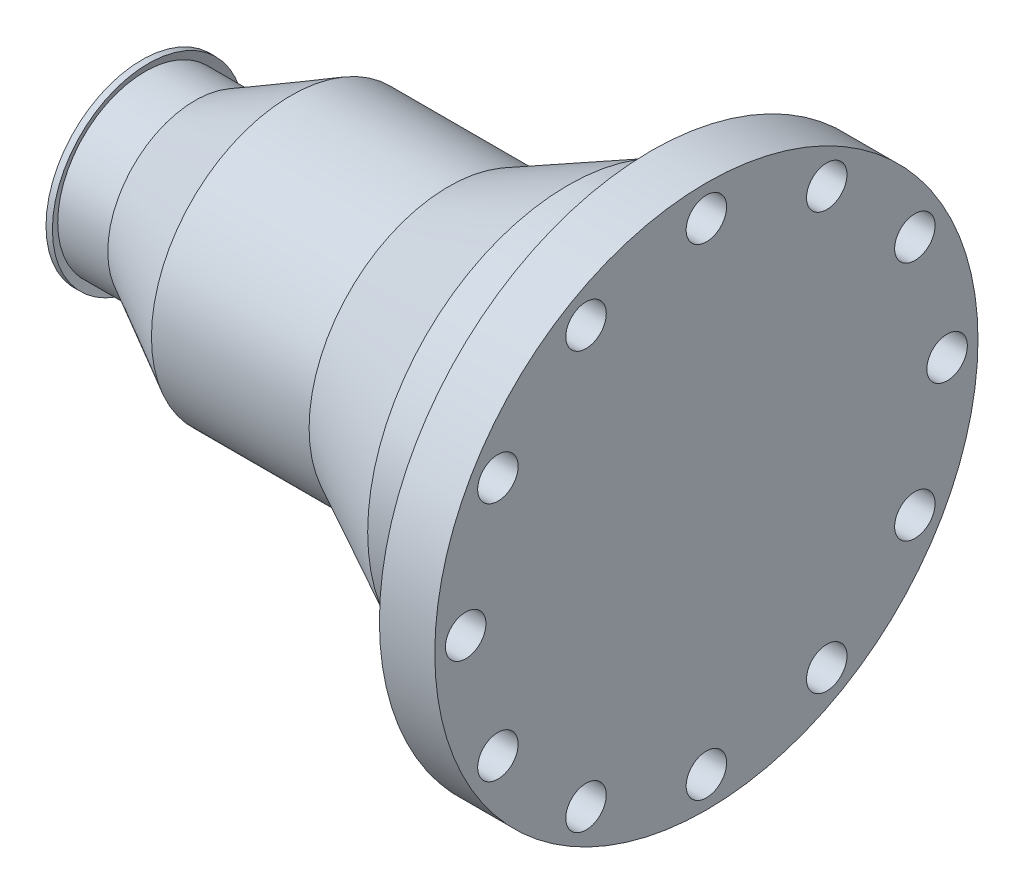
ISO-10303-21;
HEADER;
FILE_DESCRIPTION(('STEP AP214'),'2;1');
FILE_NAME('part.step','',(''),(''),'','','');
FILE_SCHEMA(('AUTOMOTIVE_DESIGN { 1 0 10303 214 1 1 1 1 }'));
ENDSEC;
DATA;
#1=APPLICATION_CONTEXT('core data for automotive mechanical design processes');
#2=APPLICATION_PROTOCOL_DEFINITION('international standard','automotive_design',2000,#1);
#3=PRODUCT_CONTEXT('',#1,'mechanical');
#4=PRODUCT('Part','Part','',(#3));
#5=PRODUCT_RELATED_PRODUCT_CATEGORY('part','',(#4));
#6=PRODUCT_DEFINITION_FORMATION('','',#4);
#7=PRODUCT_DEFINITION_CONTEXT('part definition',#1,'design');
#8=PRODUCT_DEFINITION('design','',#6,#7);
#9=PRODUCT_DEFINITION_SHAPE('','',#8);
#10=(LENGTH_UNIT() NAMED_UNIT(*) SI_UNIT(.MILLI.,.METRE.));
#11=(NAMED_UNIT(*) PLANE_ANGLE_UNIT() SI_UNIT($,.RADIAN.));
#12=(NAMED_UNIT(*) SI_UNIT($,.STERADIAN.) SOLID_ANGLE_UNIT());
#13=UNCERTAINTY_MEASURE_WITH_UNIT(LENGTH_MEASURE(1.E-05),#10,'distance_accuracy_value','');
#14=(GEOMETRIC_REPRESENTATION_CONTEXT(3) GLOBAL_UNCERTAINTY_ASSIGNED_CONTEXT((#13)) GLOBAL_UNIT_ASSIGNED_CONTEXT((#10,
#11,#12)) REPRESENTATION_CONTEXT('',''));
#15=CARTESIAN_POINT('',(0.,0.,0.));
#16=DIRECTION('',(0.,0.,1.));
#17=DIRECTION('',(1.,0.,0.));
#18=AXIS2_PLACEMENT_3D('',#15,#16,#17);
#19=CARTESIAN_POINT('',(0.,0.,0.));
#20=DIRECTION('',(1.,0.,0.));
#21=DIRECTION('',(0.,0.,-1.));
#22=AXIS2_PLACEMENT_3D('',#19,#20,#21);
#23=PLANE('',#22);
#24=CARTESIAN_POINT('',(0.,0.,0.));
#25=DIRECTION('',(-1.,0.,0.));
#26=DIRECTION('',(0.,0.,1.));
#27=AXIS2_PLACEMENT_3D('',#24,#25,#26);
#28=CIRCLE('',#27,31.);
#29=CARTESIAN_POINT('',(0.,0.,31.));
#30=VERTEX_POINT('',#29);
#31=EDGE_CURVE('E80',#30,#30,#28,.T.);
#32=ORIENTED_EDGE('',*,*,#31,.F.);
#33=EDGE_LOOP('',(#32));
#34=FACE_BOUND('',#33,.T.);
#35=CARTESIAN_POINT('',(0.,0.,0.));
#36=DIRECTION('',(-1.,0.,0.));
#37=DIRECTION('',(0.,0.,1.));
#38=AXIS2_PLACEMENT_3D('',#35,#36,#37);
#39=CIRCLE('',#38,45.);
#40=CARTESIAN_POINT('',(0.,0.,45.));
#41=VERTEX_POINT('',#40);
#42=EDGE_CURVE('E10',#41,#41,#39,.T.);
#43=ORIENTED_EDGE('',*,*,#42,.T.);
#44=EDGE_LOOP('',(#43));
#45=FACE_BOUND('',#44,.T.);
#46=ADVANCED_FACE('F37',(#34,#45),#23,.F.);
#47=CARTESIAN_POINT('',(0.,0.,0.));
#48=DIRECTION('',(-1.,0.,0.));
#49=DIRECTION('',(0.,0.,1.));
#50=AXIS2_PLACEMENT_3D('',#47,#48,#49);
#51=CYLINDRICAL_SURFACE('',#50,45.);
#52=ORIENTED_EDGE('',*,*,#42,.F.);
#53=EDGE_LOOP('',(#52));
#54=FACE_BOUND('',#53,.T.);
#55=CARTESIAN_POINT('',(3.,0.,0.));
#56=DIRECTION('',(-1.,0.,0.));
#57=DIRECTION('',(0.,0.,1.));
#58=AXIS2_PLACEMENT_3D('',#55,#56,#57);
#59=CIRCLE('',#58,45.);
#60=CARTESIAN_POINT('',(3.,0.,45.));
#61=VERTEX_POINT('',#60);
#62=EDGE_CURVE('E43',#61,#61,#59,.T.);
#63=ORIENTED_EDGE('',*,*,#62,.T.);
#64=EDGE_LOOP('',(#63));
#65=FACE_BOUND('',#64,.T.);
#66=ADVANCED_FACE('F232',(#54,#65),#51,.T.);
#67=CARTESIAN_POINT('',(1.5,0.,0.));
#68=DIRECTION('',(1.,0.,0.));
#69=DIRECTION('',(0.,0.,-1.));
#70=AXIS2_PLACEMENT_3D('',#67,#68,#69);
#71=CONICAL_SURFACE('',#70,41.,1.21202565652432);
#72=ORIENTED_EDGE('',*,*,#62,.F.);
#73=EDGE_LOOP('',(#72));
#74=FACE_BOUND('',#73,.T.);
#75=CARTESIAN_POINT('',(1.5,0.,0.));
#76=DIRECTION('',(-1.,0.,0.));
#77=DIRECTION('',(0.,0.,1.));
#78=AXIS2_PLACEMENT_3D('',#75,#76,#77);
#79=CIRCLE('',#78,41.);
#80=CARTESIAN_POINT('',(1.5,0.,41.));
#81=VERTEX_POINT('',#80);
#82=EDGE_CURVE('E47',#81,#81,#79,.T.);
#83=ORIENTED_EDGE('',*,*,#82,.T.);
#84=EDGE_LOOP('',(#83));
#85=FACE_BOUND('',#84,.T.);
#86=ADVANCED_FACE('F238',(#74,#85),#71,.F.);
#87=CARTESIAN_POINT('',(0.,0.,0.));
#88=DIRECTION('',(-1.,0.,0.));
#89=DIRECTION('',(0.,0.,1.));
#90=AXIS2_PLACEMENT_3D('',#87,#88,#89);
#91=CYLINDRICAL_SURFACE('',#90,41.);
#92=ORIENTED_EDGE('',*,*,#82,.F.);
#93=EDGE_LOOP('',(#92));
#94=FACE_BOUND('',#93,.T.);
#95=CARTESIAN_POINT('',(25.,0.,0.));
#96=DIRECTION('',(-1.,0.,0.));
#97=DIRECTION('',(0.,0.,1.));
#98=AXIS2_PLACEMENT_3D('',#95,#96,#97);
#99=CIRCLE('',#98,41.);
#100=CARTESIAN_POINT('',(25.,0.,41.));
#101=VERTEX_POINT('',#100);
#102=EDGE_CURVE('E51',#101,#101,#99,.T.);
#103=ORIENTED_EDGE('',*,*,#102,.T.);
#104=EDGE_LOOP('',(#103));
#105=FACE_BOUND('',#104,.T.);
#106=ADVANCED_FACE('F544',(#94,#105),#91,.T.);
#107=CARTESIAN_POINT('',(70.,0.,0.));
#108=DIRECTION('',(1.,0.,0.));
#109=DIRECTION('',(0.,0.,-1.));
#110=AXIS2_PLACEMENT_3D('',#107,#108,#109);
#111=CONICAL_SURFACE('',#110,65.5,0.498567905638218);
#112=ORIENTED_EDGE('',*,*,#102,.F.);
#113=EDGE_LOOP('',(#112));
#114=FACE_BOUND('',#113,.T.);
#115=CARTESIAN_POINT('',(70.,0.,0.));
#116=DIRECTION('',(-1.,0.,0.));
#117=DIRECTION('',(0.,0.,1.));
#118=AXIS2_PLACEMENT_3D('',#115,#116,#117);
#119=CIRCLE('',#118,65.5);
#120=CARTESIAN_POINT('',(70.,0.,65.5));
#121=VERTEX_POINT('',#120);
#122=EDGE_CURVE('E56',#121,#121,#119,.T.);
#123=ORIENTED_EDGE('',*,*,#122,.T.);
#124=EDGE_LOOP('',(#123));
#125=FACE_BOUND('',#124,.T.);
#126=ADVANCED_FACE('F535',(#114,#125),#111,.T.);
#127=CARTESIAN_POINT('',(0.,0.,0.));
#128=DIRECTION('',(-1.,0.,0.));
#129=DIRECTION('',(0.,0.,1.));
#130=AXIS2_PLACEMENT_3D('',#127,#128,#129);
#131=CYLINDRICAL_SURFACE('',#130,65.5);
#132=ORIENTED_EDGE('',*,*,#122,.F.);
#133=EDGE_LOOP('',(#132));
#134=FACE_BOUND('',#133,.T.);
#135=CARTESIAN_POINT('',(144.,0.,0.));
#136=DIRECTION('',(-1.,0.,0.));
#137=DIRECTION('',(0.,0.,1.));
#138=AXIS2_PLACEMENT_3D('',#135,#136,#137);
#139=CIRCLE('',#138,65.5);
#140=CARTESIAN_POINT('',(144.,0.,65.5));
#141=VERTEX_POINT('',#140);
#142=EDGE_CURVE('E59',#141,#141,#139,.T.);
#143=ORIENTED_EDGE('',*,*,#142,.T.);
#144=EDGE_LOOP('',(#143));
#145=FACE_BOUND('',#144,.T.);
#146=ADVANCED_FACE('F526',(#134,#145),#131,.T.);
#147=CARTESIAN_POINT('',(200.,0.,0.));
#148=DIRECTION('',(1.,0.,0.));
#149=DIRECTION('',(0.,0.,-1.));
#150=AXIS2_PLACEMENT_3D('',#147,#148,#149);
#151=CONICAL_SURFACE('',#150,94.,0.470764926542016);
#152=ORIENTED_EDGE('',*,*,#142,.F.);
#153=EDGE_LOOP('',(#152));
#154=FACE_BOUND('',#153,.T.);
#155=CARTESIAN_POINT('',(200.,0.,0.));
#156=DIRECTION('',(-1.,0.,0.));
#157=DIRECTION('',(0.,0.,1.));
#158=AXIS2_PLACEMENT_3D('',#155,#156,#157);
#159=CIRCLE('',#158,94.);
#160=CARTESIAN_POINT('',(200.,0.,94.));
#161=VERTEX_POINT('',#160);
#162=EDGE_CURVE('E62',#161,#161,#159,.T.);
#163=ORIENTED_EDGE('',*,*,#162,.T.);
#164=EDGE_LOOP('',(#163));
#165=FACE_BOUND('',#164,.T.);
#166=ADVANCED_FACE('F517',(#154,#165),#151,.T.);
#167=CARTESIAN_POINT('',(0.,0.,0.));
#168=DIRECTION('',(-1.,0.,0.));
#169=DIRECTION('',(0.,0.,1.));
#170=AXIS2_PLACEMENT_3D('',#167,#168,#169);
#171=CYLINDRICAL_SURFACE('',#170,94.);
#172=ORIENTED_EDGE('',*,*,#162,.F.);
#173=EDGE_LOOP('',(#172));
#174=FACE_BOUND('',#173,.T.);
#175=CARTESIAN_POINT('',(220.,0.,0.));
#176=DIRECTION('',(-1.,0.,0.));
#177=DIRECTION('',(0.,0.,1.));
#178=AXIS2_PLACEMENT_3D('',#175,#176,#177);
#179=CIRCLE('',#178,94.);
#180=CARTESIAN_POINT('',(220.,0.,94.));
#181=VERTEX_POINT('',#180);
#182=EDGE_CURVE('E65',#181,#181,#179,.T.);
#183=ORIENTED_EDGE('',*,*,#182,.T.);
#184=EDGE_LOOP('',(#183));
#185=FACE_BOUND('',#184,.T.);
#186=ADVANCED_FACE('F508',(#174,#185),#171,.T.);
#187=CARTESIAN_POINT('',(220.,94.,0.));
#188=DIRECTION('',(1.,0.,0.));
#189=DIRECTION('',(0.,0.,-1.));
#190=AXIS2_PLACEMENT_3D('',#187,#188,#189);
#191=PLANE('',#190);
#192=ORIENTED_EDGE('',*,*,#182,.F.);
#193=EDGE_LOOP('',(#192));
#194=FACE_BOUND('',#193,.T.);
#195=CARTESIAN_POINT('',(220.,0.,0.));
#196=DIRECTION('',(-1.,0.,0.));
#197=DIRECTION('',(0.,0.,1.));
#198=AXIS2_PLACEMENT_3D('',#195,#196,#197);
#199=CIRCLE('',#198,95.);
#200=CARTESIAN_POINT('',(220.,0.,95.));
#201=VERTEX_POINT('',#200);
#202=EDGE_CURVE('E68',#201,#201,#199,.T.);
#203=ORIENTED_EDGE('',*,*,#202,.T.);
#204=EDGE_LOOP('',(#203));
#205=FACE_BOUND('',#204,.T.);
#206=ADVANCED_FACE('F499',(#194,#205),#191,.F.);
#207=CARTESIAN_POINT('',(0.,0.,0.));
#208=DIRECTION('',(-1.,0.,0.));
#209=DIRECTION('',(0.,0.,1.));
#210=AXIS2_PLACEMENT_3D('',#207,#208,#209);
#211=CYLINDRICAL_SURFACE('',#210,95.);
#212=ORIENTED_EDGE('',*,*,#202,.F.);
#213=EDGE_LOOP('',(#212));
#214=FACE_BOUND('',#213,.T.);
#215=CARTESIAN_POINT('',(239.,0.,0.));
#216=DIRECTION('',(-1.,0.,0.));
#217=DIRECTION('',(0.,0.,1.));
#218=AXIS2_PLACEMENT_3D('',#215,#216,#217);
#219=CIRCLE('',#218,95.);
#220=CARTESIAN_POINT('',(239.,0.,95.));
#221=VERTEX_POINT('',#220);
#222=EDGE_CURVE('E71',#221,#221,#219,.T.);
#223=ORIENTED_EDGE('',*,*,#222,.T.);
#224=EDGE_LOOP('',(#223));
#225=FACE_BOUND('',#224,.T.);
#226=ADVANCED_FACE('F228',(#214,#225),#211,.T.);
#227=CARTESIAN_POINT('',(239.,100.,0.));
#228=DIRECTION('',(1.,0.,0.));
#229=DIRECTION('',(0.,0.,-1.));
#230=AXIS2_PLACEMENT_3D('',#227,#228,#229);
#231=PLANE('',#230);
#232=CARTESIAN_POINT('',(239.,97.8608706276416,-56.5));
#233=DIRECTION('',(1.,0.,0.));
#234=DIRECTION('',(0.,0.,-1.));
#235=AXIS2_PLACEMENT_3D('',#232,#233,#234);
#236=CIRCLE('',#235,9.50000000000001);
#237=CARTESIAN_POINT('',(239.,97.8608706276416,-66.));
#238=VERTEX_POINT('',#237);
#239=EDGE_CURVE('E179',#238,#238,#236,.F.);
#240=ORIENTED_EDGE('',*,*,#239,.F.);
#241=EDGE_LOOP('',(#240));
#242=FACE_BOUND('',#241,.T.);
#243=CARTESIAN_POINT('',(239.,56.4999999999999,-97.8608706276416));
#244=DIRECTION('',(1.,0.,0.));
#245=DIRECTION('',(0.,0.,-1.));
#246=AXIS2_PLACEMENT_3D('',#243,#244,#245);
#247=CIRCLE('',#246,9.5);
#248=CARTESIAN_POINT('',(239.,56.4999999999999,-107.360870627642));
#249=VERTEX_POINT('',#248);
#250=EDGE_CURVE('E173',#249,#249,#247,.F.);
#251=ORIENTED_EDGE('',*,*,#250,.F.);
#252=EDGE_LOOP('',(#251));
#253=FACE_BOUND('',#252,.T.);
#254=CARTESIAN_POINT('',(239.,0.,-113.));
#255=DIRECTION('',(1.,0.,0.));
#256=DIRECTION('',(0.,0.,-1.));
#257=AXIS2_PLACEMENT_3D('',#254,#255,#256);
#258=CIRCLE('',#257,9.49999999999999);
#259=CARTESIAN_POINT('',(239.,0.,-122.5));
#260=VERTEX_POINT('',#259);
#261=EDGE_CURVE('E167',#260,#260,#258,.F.);
#262=ORIENTED_EDGE('',*,*,#261,.F.);
#263=EDGE_LOOP('',(#262));
#264=FACE_BOUND('',#263,.T.);
#265=CARTESIAN_POINT('',(239.,-56.5,-97.8608706276415));
#266=DIRECTION('',(1.,0.,0.));
#267=DIRECTION('',(0.,0.,-1.));
#268=AXIS2_PLACEMENT_3D('',#265,#266,#267);
#269=CIRCLE('',#268,9.5);
#270=CARTESIAN_POINT('',(239.,-56.5,-107.360870627642));
#271=VERTEX_POINT('',#270);
#272=EDGE_CURVE('E161',#271,#271,#269,.F.);
#273=ORIENTED_EDGE('',*,*,#272,.F.);
#274=EDGE_LOOP('',(#273));
#275=FACE_BOUND('',#274,.T.);
#276=CARTESIAN_POINT('',(239.,-97.8608706276416,-56.5));
#277=DIRECTION('',(1.,0.,0.));
#278=DIRECTION('',(0.,0.,-1.));
#279=AXIS2_PLACEMENT_3D('',#276,#277,#278);
#280=CIRCLE('',#279,9.50000000000001);
#281=CARTESIAN_POINT('',(239.,-97.8608706276416,-66.));
#282=VERTEX_POINT('',#281);
#283=EDGE_CURVE('E155',#282,#282,#280,.F.);
#284=ORIENTED_EDGE('',*,*,#283,.F.);
#285=EDGE_LOOP('',(#284));
#286=FACE_BOUND('',#285,.T.);
#287=CARTESIAN_POINT('',(239.,-113.,0.));
#288=DIRECTION('',(1.,0.,0.));
#289=DIRECTION('',(0.,0.,-1.));
#290=AXIS2_PLACEMENT_3D('',#287,#288,#289);
#291=CIRCLE('',#290,9.49999999999998);
#292=CARTESIAN_POINT('',(239.,-113.,-9.49999999999998));
#293=VERTEX_POINT('',#292);
#294=EDGE_CURVE('E149',#293,#293,#291,.F.);
#295=ORIENTED_EDGE('',*,*,#294,.F.);
#296=EDGE_LOOP('',(#295));
#297=FACE_BOUND('',#296,.T.);
#298=CARTESIAN_POINT('',(239.,-97.8608706276415,56.5));
#299=DIRECTION('',(1.,0.,0.));
#300=DIRECTION('',(0.,0.,-1.));
#301=AXIS2_PLACEMENT_3D('',#298,#299,#300);
#302=CIRCLE('',#301,9.5);
#303=CARTESIAN_POINT('',(239.,-97.8608706276415,47.));
#304=VERTEX_POINT('',#303);
#305=EDGE_CURVE('E143',#304,#304,#302,.F.);
#306=ORIENTED_EDGE('',*,*,#305,.F.);
#307=EDGE_LOOP('',(#306));
#308=FACE_BOUND('',#307,.T.);
#309=CARTESIAN_POINT('',(239.,-56.5,97.8608706276416));
#310=DIRECTION('',(1.,0.,0.));
#311=DIRECTION('',(0.,0.,-1.));
#312=AXIS2_PLACEMENT_3D('',#309,#310,#311);
#313=CIRCLE('',#312,9.5);
#314=CARTESIAN_POINT('',(239.,-56.5,88.3608706276416));
#315=VERTEX_POINT('',#314);
#316=EDGE_CURVE('E137',#315,#315,#313,.F.);
#317=ORIENTED_EDGE('',*,*,#316,.F.);
#318=EDGE_LOOP('',(#317));
#319=FACE_BOUND('',#318,.T.);
#320=CARTESIAN_POINT('',(239.,0.,113.));
#321=DIRECTION('',(1.,0.,0.));
#322=DIRECTION('',(0.,0.,-1.));
#323=AXIS2_PLACEMENT_3D('',#320,#321,#322);
#324=CIRCLE('',#323,9.49999999999999);
#325=CARTESIAN_POINT('',(239.,0.,103.5));
#326=VERTEX_POINT('',#325);
#327=EDGE_CURVE('E131',#326,#326,#324,.F.);
#328=ORIENTED_EDGE('',*,*,#327,.F.);
#329=EDGE_LOOP('',(#328));
#330=FACE_BOUND('',#329,.T.);
#331=CARTESIAN_POINT('',(239.,56.5,97.8608706276416));
#332=DIRECTION('',(1.,0.,0.));
#333=DIRECTION('',(0.,0.,-1.));
#334=AXIS2_PLACEMENT_3D('',#331,#332,#333);
#335=CIRCLE('',#334,9.5);
#336=CARTESIAN_POINT('',(239.,56.5,88.3608706276416));
#337=VERTEX_POINT('',#336);
#338=EDGE_CURVE('E125',#337,#337,#335,.F.);
#339=ORIENTED_EDGE('',*,*,#338,.F.);
#340=EDGE_LOOP('',(#339));
#341=FACE_BOUND('',#340,.T.);
#342=CARTESIAN_POINT('',(239.,97.8608706276416,56.5));
#343=DIRECTION('',(1.,0.,0.));
#344=DIRECTION('',(0.,0.,-1.));
#345=AXIS2_PLACEMENT_3D('',#342,#343,#344);
#346=CIRCLE('',#345,9.5);
#347=CARTESIAN_POINT('',(239.,97.8608706276416,47.));
#348=VERTEX_POINT('',#347);
#349=EDGE_CURVE('E119',#348,#348,#346,.F.);
#350=ORIENTED_EDGE('',*,*,#349,.F.);
#351=EDGE_LOOP('',(#350));
#352=FACE_BOUND('',#351,.T.);
#353=CARTESIAN_POINT('',(239.,113.,0.));
#354=DIRECTION('',(1.,0.,0.));
#355=DIRECTION('',(0.,0.,-1.));
#356=AXIS2_PLACEMENT_3D('',#353,#354,#355);
#357=CIRCLE('',#356,9.50000000000001);
#358=CARTESIAN_POINT('',(239.,113.,-9.50000000000001));
#359=VERTEX_POINT('',#358);
#360=EDGE_CURVE('E113',#359,#359,#357,.F.);
#361=ORIENTED_EDGE('',*,*,#360,.F.);
#362=EDGE_LOOP('',(#361));
#363=FACE_BOUND('',#362,.T.);
#364=ORIENTED_EDGE('',*,*,#222,.F.);
#365=EDGE_LOOP('',(#364));
#366=FACE_BOUND('',#365,.T.);
#367=CARTESIAN_POINT('',(239.,0.,0.));
#368=DIRECTION('',(-1.,0.,0.));
#369=DIRECTION('',(0.,0.,1.));
#370=AXIS2_PLACEMENT_3D('',#367,#368,#369);
#371=CIRCLE('',#370,127.5);
#372=CARTESIAN_POINT('',(239.,0.,127.5));
#373=VERTEX_POINT('',#372);
#374=EDGE_CURVE('E74',#373,#373,#371,.T.);
#375=ORIENTED_EDGE('',*,*,#374,.T.);
#376=EDGE_LOOP('',(#375));
#377=FACE_BOUND('',#376,.T.);
#378=ADVANCED_FACE('F220',(#242,#253,#264,#275,#286,#297,#308,#319,#330,#341,#352,#363,#366,
#377),#231,.F.);
#379=CARTESIAN_POINT('',(0.,0.,0.));
#380=DIRECTION('',(-1.,0.,0.));
#381=DIRECTION('',(0.,0.,1.));
#382=AXIS2_PLACEMENT_3D('',#379,#380,#381);
#383=CYLINDRICAL_SURFACE('',#382,127.5);
#384=ORIENTED_EDGE('',*,*,#374,.F.);
#385=EDGE_LOOP('',(#384));
#386=FACE_BOUND('',#385,.T.);
#387=CARTESIAN_POINT('',(265.,0.,0.));
#388=DIRECTION('',(-1.,0.,0.));
#389=DIRECTION('',(0.,0.,1.));
#390=AXIS2_PLACEMENT_3D('',#387,#388,#389);
#391=CIRCLE('',#390,127.5);
#392=CARTESIAN_POINT('',(265.,0.,127.5));
#393=VERTEX_POINT('',#392);
#394=EDGE_CURVE('E77',#393,#393,#391,.T.);
#395=ORIENTED_EDGE('',*,*,#394,.T.);
#396=EDGE_LOOP('',(#395));
#397=FACE_BOUND('',#396,.T.);
#398=ADVANCED_FACE('F193',(#386,#397),#383,.T.);
#399=CARTESIAN_POINT('',(265.,127.5,0.));
#400=DIRECTION('',(-1.,0.,0.));
#401=DIRECTION('',(0.,0.,1.));
#402=AXIS2_PLACEMENT_3D('',#399,#400,#401);
#403=PLANE('',#402);
#404=CARTESIAN_POINT('',(265.,97.8608706276416,-56.5));
#405=DIRECTION('',(1.,0.,0.));
#406=DIRECTION('',(0.,0.,-1.));
#407=AXIS2_PLACEMENT_3D('',#404,#405,#406);
#408=CIRCLE('',#407,9.50000000000001);
#409=CARTESIAN_POINT('',(265.,97.8608706276416,-66.));
#410=VERTEX_POINT('',#409);
#411=EDGE_CURVE('E182',#410,#410,#408,.T.);
#412=ORIENTED_EDGE('',*,*,#411,.F.);
#413=EDGE_LOOP('',(#412));
#414=FACE_BOUND('',#413,.T.);
#415=CARTESIAN_POINT('',(265.,56.4999999999999,-97.8608706276416));
#416=DIRECTION('',(1.,0.,0.));
#417=DIRECTION('',(0.,0.,-1.));
#418=AXIS2_PLACEMENT_3D('',#415,#416,#417);
#419=CIRCLE('',#418,9.5);
#420=CARTESIAN_POINT('',(265.,56.4999999999999,-107.360870627642));
#421=VERTEX_POINT('',#420);
#422=EDGE_CURVE('E176',#421,#421,#419,.T.);
#423=ORIENTED_EDGE('',*,*,#422,.F.);
#424=EDGE_LOOP('',(#423));
#425=FACE_BOUND('',#424,.T.);
#426=CARTESIAN_POINT('',(265.,0.,-113.));
#427=DIRECTION('',(1.,0.,0.));
#428=DIRECTION('',(0.,0.,-1.));
#429=AXIS2_PLACEMENT_3D('',#426,#427,#428);
#430=CIRCLE('',#429,9.49999999999999);
#431=CARTESIAN_POINT('',(265.,0.,-122.5));
#432=VERTEX_POINT('',#431);
#433=EDGE_CURVE('E170',#432,#432,#430,.T.);
#434=ORIENTED_EDGE('',*,*,#433,.F.);
#435=EDGE_LOOP('',(#434));
#436=FACE_BOUND('',#435,.T.);
#437=CARTESIAN_POINT('',(265.,-56.5,-97.8608706276415));
#438=DIRECTION('',(1.,0.,0.));
#439=DIRECTION('',(0.,0.,-1.));
#440=AXIS2_PLACEMENT_3D('',#437,#438,#439);
#441=CIRCLE('',#440,9.5);
#442=CARTESIAN_POINT('',(265.,-56.5,-107.360870627642));
#443=VERTEX_POINT('',#442);
#444=EDGE_CURVE('E164',#443,#443,#441,.T.);
#445=ORIENTED_EDGE('',*,*,#444,.F.);
#446=EDGE_LOOP('',(#445));
#447=FACE_BOUND('',#446,.T.);
#448=CARTESIAN_POINT('',(265.,-97.8608706276416,-56.5));
#449=DIRECTION('',(1.,0.,0.));
#450=DIRECTION('',(0.,0.,-1.));
#451=AXIS2_PLACEMENT_3D('',#448,#449,#450);
#452=CIRCLE('',#451,9.50000000000001);
#453=CARTESIAN_POINT('',(265.,-97.8608706276416,-66.));
#454=VERTEX_POINT('',#453);
#455=EDGE_CURVE('E158',#454,#454,#452,.T.);
#456=ORIENTED_EDGE('',*,*,#455,.F.);
#457=EDGE_LOOP('',(#456));
#458=FACE_BOUND('',#457,.T.);
#459=CARTESIAN_POINT('',(265.,-113.,0.));
#460=DIRECTION('',(1.,0.,0.));
#461=DIRECTION('',(0.,0.,-1.));
#462=AXIS2_PLACEMENT_3D('',#459,#460,#461);
#463=CIRCLE('',#462,9.49999999999998);
#464=CARTESIAN_POINT('',(265.,-113.,-9.49999999999998));
#465=VERTEX_POINT('',#464);
#466=EDGE_CURVE('E152',#465,#465,#463,.T.);
#467=ORIENTED_EDGE('',*,*,#466,.F.);
#468=EDGE_LOOP('',(#467));
#469=FACE_BOUND('',#468,.T.);
#470=CARTESIAN_POINT('',(265.,-97.8608706276415,56.5));
#471=DIRECTION('',(1.,0.,0.));
#472=DIRECTION('',(0.,0.,-1.));
#473=AXIS2_PLACEMENT_3D('',#470,#471,#472);
#474=CIRCLE('',#473,9.5);
#475=CARTESIAN_POINT('',(265.,-97.8608706276415,47.));
#476=VERTEX_POINT('',#475);
#477=EDGE_CURVE('E146',#476,#476,#474,.T.);
#478=ORIENTED_EDGE('',*,*,#477,.F.);
#479=EDGE_LOOP('',(#478));
#480=FACE_BOUND('',#479,.T.);
#481=CARTESIAN_POINT('',(265.,-56.5,97.8608706276416));
#482=DIRECTION('',(1.,0.,0.));
#483=DIRECTION('',(0.,0.,-1.));
#484=AXIS2_PLACEMENT_3D('',#481,#482,#483);
#485=CIRCLE('',#484,9.5);
#486=CARTESIAN_POINT('',(265.,-56.5,88.3608706276416));
#487=VERTEX_POINT('',#486);
#488=EDGE_CURVE('E140',#487,#487,#485,.T.);
#489=ORIENTED_EDGE('',*,*,#488,.F.);
#490=EDGE_LOOP('',(#489));
#491=FACE_BOUND('',#490,.T.);
#492=CARTESIAN_POINT('',(265.,0.,113.));
#493=DIRECTION('',(1.,0.,0.));
#494=DIRECTION('',(0.,0.,-1.));
#495=AXIS2_PLACEMENT_3D('',#492,#493,#494);
#496=CIRCLE('',#495,9.49999999999999);
#497=CARTESIAN_POINT('',(265.,0.,103.5));
#498=VERTEX_POINT('',#497);
#499=EDGE_CURVE('E134',#498,#498,#496,.T.);
#500=ORIENTED_EDGE('',*,*,#499,.F.);
#501=EDGE_LOOP('',(#500));
#502=FACE_BOUND('',#501,.T.);
#503=CARTESIAN_POINT('',(265.,56.5,97.8608706276416));
#504=DIRECTION('',(1.,0.,0.));
#505=DIRECTION('',(0.,0.,-1.));
#506=AXIS2_PLACEMENT_3D('',#503,#504,#505);
#507=CIRCLE('',#506,9.5);
#508=CARTESIAN_POINT('',(265.,56.5,88.3608706276416));
#509=VERTEX_POINT('',#508);
#510=EDGE_CURVE('E128',#509,#509,#507,.T.);
#511=ORIENTED_EDGE('',*,*,#510,.F.);
#512=EDGE_LOOP('',(#511));
#513=FACE_BOUND('',#512,.T.);
#514=CARTESIAN_POINT('',(265.,97.8608706276416,56.5));
#515=DIRECTION('',(1.,0.,0.));
#516=DIRECTION('',(0.,0.,-1.));
#517=AXIS2_PLACEMENT_3D('',#514,#515,#516);
#518=CIRCLE('',#517,9.5);
#519=CARTESIAN_POINT('',(265.,97.8608706276416,47.));
#520=VERTEX_POINT('',#519);
#521=EDGE_CURVE('E122',#520,#520,#518,.T.);
#522=ORIENTED_EDGE('',*,*,#521,.F.);
#523=EDGE_LOOP('',(#522));
#524=FACE_BOUND('',#523,.T.);
#525=CARTESIAN_POINT('',(265.,113.,0.));
#526=DIRECTION('',(1.,0.,0.));
#527=DIRECTION('',(0.,0.,-1.));
#528=AXIS2_PLACEMENT_3D('',#525,#526,#527);
#529=CIRCLE('',#528,9.50000000000001);
#530=CARTESIAN_POINT('',(265.,113.,-9.50000000000001));
#531=VERTEX_POINT('',#530);
#532=EDGE_CURVE('E116',#531,#531,#529,.T.);
#533=ORIENTED_EDGE('',*,*,#532,.F.);
#534=EDGE_LOOP('',(#533));
#535=FACE_BOUND('',#534,.T.);
#536=ORIENTED_EDGE('',*,*,#394,.F.);
#537=EDGE_LOOP('',(#536));
#538=FACE_BOUND('',#537,.T.);
#539=ADVANCED_FACE('F189',(#414,#425,#436,#447,#458,#469,#480,#491,#502,#513,#524,#535,#538),
#403,.F.);
#540=CARTESIAN_POINT('',(0.,0.,0.));
#541=DIRECTION('',(-1.,0.,0.));
#542=DIRECTION('',(0.,0.,1.));
#543=AXIS2_PLACEMENT_3D('',#540,#541,#542);
#544=CYLINDRICAL_SURFACE('',#543,31.);
#545=ORIENTED_EDGE('',*,*,#31,.T.);
#546=EDGE_LOOP('',(#545));
#547=FACE_BOUND('',#546,.T.);
#548=CARTESIAN_POINT('',(42.,0.,0.));
#549=DIRECTION('',(-1.,0.,0.));
#550=DIRECTION('',(0.,0.,1.));
#551=AXIS2_PLACEMENT_3D('',#548,#549,#550);
#552=CIRCLE('',#551,31.);
#553=CARTESIAN_POINT('',(42.,0.,31.));
#554=VERTEX_POINT('',#553);
#555=EDGE_CURVE('E83',#554,#554,#552,.T.);
#556=ORIENTED_EDGE('',*,*,#555,.F.);
#557=EDGE_LOOP('',(#556));
#558=FACE_BOUND('',#557,.T.);
#559=ADVANCED_FACE('F192',(#547,#558),#544,.F.);
#560=CARTESIAN_POINT('',(70.,0.,0.));
#561=DIRECTION('',(1.,0.,0.));
#562=DIRECTION('',(0.,0.,-1.));
#563=AXIS2_PLACEMENT_3D('',#560,#561,#562);
#564=CONICAL_SURFACE('',#563,38.502577,0.261799374867879);
#565=ORIENTED_EDGE('',*,*,#555,.T.);
#566=EDGE_LOOP('',(#565));
#567=FACE_BOUND('',#566,.T.);
#568=CARTESIAN_POINT('',(70.,0.,0.));
#569=DIRECTION('',(-1.,0.,0.));
#570=DIRECTION('',(0.,0.,1.));
#571=AXIS2_PLACEMENT_3D('',#568,#569,#570);
#572=CIRCLE('',#571,38.502577);
#573=CARTESIAN_POINT('',(70.,0.,38.502577));
#574=VERTEX_POINT('',#573);
#575=EDGE_CURVE('E86',#574,#574,#572,.T.);
#576=ORIENTED_EDGE('',*,*,#575,.F.);
#577=EDGE_LOOP('',(#576));
#578=FACE_BOUND('',#577,.T.);
#579=ADVANCED_FACE('F243',(#567,#578),#564,.F.);
#580=CARTESIAN_POINT('',(107.802202951022,0.,0.));
#581=DIRECTION('',(-1.,0.,0.));
#582=DIRECTION('',(0.,0.,1.));
#583=AXIS2_PLACEMENT_3D('',#580,#581,#582);
#584=DEGENERATE_TOROIDAL_SURFACE('',#583,5.77654352226822,49.9999981513586,.T.);
#585=ORIENTED_EDGE('',*,*,#575,.T.);
#586=EDGE_LOOP('',(#585));
#587=FACE_BOUND('',#586,.T.);
#588=CARTESIAN_POINT('',(90.,0.,0.));
#589=DIRECTION('',(-1.,0.,0.));
#590=DIRECTION('',(0.,0.,1.));
#591=AXIS2_PLACEMENT_3D('',#588,#589,#590);
#592=CIRCLE('',#591,52.5);
#593=CARTESIAN_POINT('',(90.,0.,52.5));
#594=VERTEX_POINT('',#593);
#595=EDGE_CURVE('E89',#594,#594,#592,.T.);
#596=ORIENTED_EDGE('',*,*,#595,.F.);
#597=EDGE_LOOP('',(#596));
#598=FACE_BOUND('',#597,.T.);
#599=ADVANCED_FACE('F249',(#587,#598),#584,.F.);
#600=CARTESIAN_POINT('',(0.,0.,0.));
#601=DIRECTION('',(-1.,0.,0.));
#602=DIRECTION('',(0.,0.,1.));
#603=AXIS2_PLACEMENT_3D('',#600,#601,#602);
#604=CYLINDRICAL_SURFACE('',#603,52.5);
#605=ORIENTED_EDGE('',*,*,#595,.T.);
#606=EDGE_LOOP('',(#605));
#607=FACE_BOUND('',#606,.T.);
#608=CARTESIAN_POINT('',(142.,0.,0.));
#609=DIRECTION('',(-1.,0.,0.));
#610=DIRECTION('',(0.,0.,1.));
#611=AXIS2_PLACEMENT_3D('',#608,#609,#610);
#612=CIRCLE('',#611,52.5);
#613=CARTESIAN_POINT('',(142.,0.,52.5));
#614=VERTEX_POINT('',#613);
#615=EDGE_CURVE('E92',#614,#614,#612,.T.);
#616=ORIENTED_EDGE('',*,*,#615,.F.);
#617=EDGE_LOOP('',(#616));
#618=FACE_BOUND('',#617,.T.);
#619=ADVANCED_FACE('F255',(#607,#618),#604,.F.);
#620=CARTESIAN_POINT('',(142.75,0.,0.));
#621=DIRECTION('',(-1.,0.,0.));
#622=DIRECTION('',(0.,0.,1.));
#623=AXIS2_PLACEMENT_3D('',#620,#621,#622);
#624=TOROIDAL_SURFACE('',#623,49.8031848031275,2.79916276877255);
#625=ORIENTED_EDGE('',*,*,#615,.T.);
#626=EDGE_LOOP('',(#625));
#627=FACE_BOUND('',#626,.T.);
#628=CARTESIAN_POINT('',(143.5,0.,0.));
#629=DIRECTION('',(-1.,0.,0.));
#630=DIRECTION('',(0.,0.,1.));
#631=AXIS2_PLACEMENT_3D('',#628,#629,#630);
#632=CIRCLE('',#631,52.5);
#633=CARTESIAN_POINT('',(143.5,0.,52.5));
#634=VERTEX_POINT('',#633);
#635=EDGE_CURVE('E95',#634,#634,#632,.T.);
#636=ORIENTED_EDGE('',*,*,#635,.F.);
#637=EDGE_LOOP('',(#636));
#638=FACE_BOUND('',#637,.T.);
#639=ADVANCED_FACE('F261',(#627,#638),#624,.F.);
#640=CARTESIAN_POINT('',(0.,0.,0.));
#641=DIRECTION('',(-1.,0.,0.));
#642=DIRECTION('',(0.,0.,1.));
#643=AXIS2_PLACEMENT_3D('',#640,#641,#642);
#644=CYLINDRICAL_SURFACE('',#643,52.5);
#645=ORIENTED_EDGE('',*,*,#635,.T.);
#646=EDGE_LOOP('',(#645));
#647=FACE_BOUND('',#646,.T.);
#648=CARTESIAN_POINT('',(146.669872,0.,0.));
#649=DIRECTION('',(-1.,0.,0.));
#650=DIRECTION('',(0.,0.,1.));
#651=AXIS2_PLACEMENT_3D('',#648,#649,#650);
#652=CIRCLE('',#651,52.5);
#653=CARTESIAN_POINT('',(146.669872,0.,52.5));
#654=VERTEX_POINT('',#653);
#655=EDGE_CURVE('E98',#654,#654,#652,.T.);
#656=ORIENTED_EDGE('',*,*,#655,.F.);
#657=EDGE_LOOP('',(#656));
#658=FACE_BOUND('',#657,.T.);
#659=ADVANCED_FACE('F267',(#647,#658),#644,.F.);
#660=CARTESIAN_POINT('',(147.593438045,0.,0.));
#661=DIRECTION('',(-1.,0.,0.));
#662=DIRECTION('',(0.,0.,1.));
#663=AXIS2_PLACEMENT_3D('',#660,#661,#662);
#664=TOROIDAL_SURFACE('',#663,53.580573582,1.42148285448445);
#665=ORIENTED_EDGE('',*,*,#655,.T.);
#666=EDGE_LOOP('',(#665));
#667=FACE_BOUND('',#666,.T.);
#668=CARTESIAN_POINT('',(147.669872,0.,0.));
#669=DIRECTION('',(-1.,0.,0.));
#670=DIRECTION('',(0.,0.,1.));
#671=AXIS2_PLACEMENT_3D('',#668,#669,#670);
#672=CIRCLE('',#671,55.);
#673=CARTESIAN_POINT('',(147.669872,0.,55.));
#674=VERTEX_POINT('',#673);
#675=EDGE_CURVE('E101',#674,#674,#672,.T.);
#676=ORIENTED_EDGE('',*,*,#675,.F.);
#677=EDGE_LOOP('',(#676));
#678=FACE_BOUND('',#677,.T.);
#679=ADVANCED_FACE('F273',(#667,#678),#664,.F.);
#680=CARTESIAN_POINT('',(0.,0.,0.));
#681=DIRECTION('',(-1.,0.,0.));
#682=DIRECTION('',(0.,0.,1.));
#683=AXIS2_PLACEMENT_3D('',#680,#681,#682);
#684=CYLINDRICAL_SURFACE('',#683,55.);
#685=ORIENTED_EDGE('',*,*,#675,.T.);
#686=EDGE_LOOP('',(#685));
#687=FACE_BOUND('',#686,.T.);
#688=CARTESIAN_POINT('',(200.,0.,0.));
#689=DIRECTION('',(-1.,0.,0.));
#690=DIRECTION('',(0.,0.,1.));
#691=AXIS2_PLACEMENT_3D('',#688,#689,#690);
#692=CIRCLE('',#691,55.);
#693=CARTESIAN_POINT('',(200.,0.,55.));
#694=VERTEX_POINT('',#693);
#695=EDGE_CURVE('E104',#694,#694,#692,.T.);
#696=ORIENTED_EDGE('',*,*,#695,.F.);
#697=EDGE_LOOP('',(#696));
#698=FACE_BOUND('',#697,.T.);
#699=ADVANCED_FACE('F279',(#687,#698),#684,.F.);
#700=CARTESIAN_POINT('',(200.,55.,0.));
#701=DIRECTION('',(-1.,0.,0.));
#702=DIRECTION('',(0.,0.,1.));
#703=AXIS2_PLACEMENT_3D('',#700,#701,#702);
#704=PLANE('',#703);
#705=ORIENTED_EDGE('',*,*,#695,.T.);
#706=EDGE_LOOP('',(#705));
#707=FACE_BOUND('',#706,.T.);
#708=CARTESIAN_POINT('',(200.,0.,0.));
#709=DIRECTION('',(-1.,0.,0.));
#710=DIRECTION('',(0.,0.,1.));
#711=AXIS2_PLACEMENT_3D('',#708,#709,#710);
#712=CIRCLE('',#711,38.502577);
#713=CARTESIAN_POINT('',(200.,0.,38.502577));
#714=VERTEX_POINT('',#713);
#715=EDGE_CURVE('E107',#714,#714,#712,.T.);
#716=ORIENTED_EDGE('',*,*,#715,.F.);
#717=EDGE_LOOP('',(#716));
#718=FACE_BOUND('',#717,.T.);
#719=ADVANCED_FACE('F285',(#707,#718),#704,.T.);
#720=CARTESIAN_POINT('',(0.,0.,0.));
#721=DIRECTION('',(-1.,0.,0.));
#722=DIRECTION('',(0.,0.,1.));
#723=AXIS2_PLACEMENT_3D('',#720,#721,#722);
#724=CYLINDRICAL_SURFACE('',#723,38.502577);
#725=ORIENTED_EDGE('',*,*,#715,.T.);
#726=EDGE_LOOP('',(#725));
#727=FACE_BOUND('',#726,.T.);
#728=CARTESIAN_POINT('',(220.,0.,0.));
#729=DIRECTION('',(-1.,0.,0.));
#730=DIRECTION('',(0.,0.,1.));
#731=AXIS2_PLACEMENT_3D('',#728,#729,#730);
#732=CIRCLE('',#731,38.502577);
#733=CARTESIAN_POINT('',(220.,0.,38.502577));
#734=VERTEX_POINT('',#733);
#735=EDGE_CURVE('E110',#734,#734,#732,.T.);
#736=ORIENTED_EDGE('',*,*,#735,.F.);
#737=EDGE_LOOP('',(#736));
#738=FACE_BOUND('',#737,.T.);
#739=ADVANCED_FACE('F291',(#727,#738),#724,.F.);
#740=CARTESIAN_POINT('',(220.,38.502577,0.));
#741=DIRECTION('',(-1.,0.,0.));
#742=DIRECTION('',(0.,0.,1.));
#743=AXIS2_PLACEMENT_3D('',#740,#741,#742);
#744=PLANE('',#743);
#745=ORIENTED_EDGE('',*,*,#735,.T.);
#746=EDGE_LOOP('',(#745));
#747=FACE_BOUND('',#746,.T.);
#748=ADVANCED_FACE('F297',(#747),#744,.T.);
#749=CARTESIAN_POINT('',(265.,113.,0.));
#750=DIRECTION('',(-1.,0.,0.));
#751=DIRECTION('',(0.,0.,1.));
#752=AXIS2_PLACEMENT_3D('',#749,#750,#751);
#753=CYLINDRICAL_SURFACE('',#752,9.50000000000001);
#754=ORIENTED_EDGE('',*,*,#532,.T.);
#755=EDGE_LOOP('',(#754));
#756=FACE_BOUND('',#755,.T.);
#757=ORIENTED_EDGE('',*,*,#360,.T.);
#758=EDGE_LOOP('',(#757));
#759=FACE_BOUND('',#758,.T.);
#760=ADVANCED_FACE('F302',(#756,#759),#753,.F.);
#761=CARTESIAN_POINT('',(265.,97.8608706276416,56.5));
#762=DIRECTION('',(-1.,0.,0.));
#763=DIRECTION('',(0.,0.,1.));
#764=AXIS2_PLACEMENT_3D('',#761,#762,#763);
#765=CYLINDRICAL_SURFACE('',#764,9.5);
#766=ORIENTED_EDGE('',*,*,#521,.T.);
#767=EDGE_LOOP('',(#766));
#768=FACE_BOUND('',#767,.T.);
#769=ORIENTED_EDGE('',*,*,#349,.T.);
#770=EDGE_LOOP('',(#769));
#771=FACE_BOUND('',#770,.T.);
#772=ADVANCED_FACE('F307',(#768,#771),#765,.F.);
#773=CARTESIAN_POINT('',(265.,56.5,97.8608706276416));
#774=DIRECTION('',(-1.,0.,0.));
#775=DIRECTION('',(0.,0.,1.));
#776=AXIS2_PLACEMENT_3D('',#773,#774,#775);
#777=CYLINDRICAL_SURFACE('',#776,9.5);
#778=ORIENTED_EDGE('',*,*,#510,.T.);
#779=EDGE_LOOP('',(#778));
#780=FACE_BOUND('',#779,.T.);
#781=ORIENTED_EDGE('',*,*,#338,.T.);
#782=EDGE_LOOP('',(#781));
#783=FACE_BOUND('',#782,.T.);
#784=ADVANCED_FACE('F313',(#780,#783),#777,.F.);
#785=CARTESIAN_POINT('',(265.,0.,113.));
#786=DIRECTION('',(-1.,0.,0.));
#787=DIRECTION('',(0.,0.,1.));
#788=AXIS2_PLACEMENT_3D('',#785,#786,#787);
#789=CYLINDRICAL_SURFACE('',#788,9.49999999999999);
#790=ORIENTED_EDGE('',*,*,#499,.T.);
#791=EDGE_LOOP('',(#790));
#792=FACE_BOUND('',#791,.T.);
#793=ORIENTED_EDGE('',*,*,#327,.T.);
#794=EDGE_LOOP('',(#793));
#795=FACE_BOUND('',#794,.T.);
#796=ADVANCED_FACE('F317',(#792,#795),#789,.F.);
#797=CARTESIAN_POINT('',(265.,-56.5,97.8608706276416));
#798=DIRECTION('',(-1.,0.,0.));
#799=DIRECTION('',(0.,0.,1.));
#800=AXIS2_PLACEMENT_3D('',#797,#798,#799);
#801=CYLINDRICAL_SURFACE('',#800,9.5);
#802=ORIENTED_EDGE('',*,*,#488,.T.);
#803=EDGE_LOOP('',(#802));
#804=FACE_BOUND('',#803,.T.);
#805=ORIENTED_EDGE('',*,*,#316,.T.);
#806=EDGE_LOOP('',(#805));
#807=FACE_BOUND('',#806,.T.);
#808=ADVANCED_FACE('F321',(#804,#807),#801,.F.);
#809=CARTESIAN_POINT('',(265.,-97.8608706276415,56.5));
#810=DIRECTION('',(-1.,0.,0.));
#811=DIRECTION('',(0.,0.,1.));
#812=AXIS2_PLACEMENT_3D('',#809,#810,#811);
#813=CYLINDRICAL_SURFACE('',#812,9.5);
#814=ORIENTED_EDGE('',*,*,#477,.T.);
#815=EDGE_LOOP('',(#814));
#816=FACE_BOUND('',#815,.T.);
#817=ORIENTED_EDGE('',*,*,#305,.T.);
#818=EDGE_LOOP('',(#817));
#819=FACE_BOUND('',#818,.T.);
#820=ADVANCED_FACE('F325',(#816,#819),#813,.F.);
#821=CARTESIAN_POINT('',(265.,-113.,0.));
#822=DIRECTION('',(-1.,0.,0.));
#823=DIRECTION('',(0.,0.,1.));
#824=AXIS2_PLACEMENT_3D('',#821,#822,#823);
#825=CYLINDRICAL_SURFACE('',#824,9.49999999999998);
#826=ORIENTED_EDGE('',*,*,#466,.T.);
#827=EDGE_LOOP('',(#826));
#828=FACE_BOUND('',#827,.T.);
#829=ORIENTED_EDGE('',*,*,#294,.T.);
#830=EDGE_LOOP('',(#829));
#831=FACE_BOUND('',#830,.T.);
#832=ADVANCED_FACE('F329',(#828,#831),#825,.F.);
#833=CARTESIAN_POINT('',(265.,-97.8608706276416,-56.5));
#834=DIRECTION('',(-1.,0.,0.));
#835=DIRECTION('',(0.,0.,1.));
#836=AXIS2_PLACEMENT_3D('',#833,#834,#835);
#837=CYLINDRICAL_SURFACE('',#836,9.50000000000001);
#838=ORIENTED_EDGE('',*,*,#455,.T.);
#839=EDGE_LOOP('',(#838));
#840=FACE_BOUND('',#839,.T.);
#841=ORIENTED_EDGE('',*,*,#283,.T.);
#842=EDGE_LOOP('',(#841));
#843=FACE_BOUND('',#842,.T.);
#844=ADVANCED_FACE('F333',(#840,#843),#837,.F.);
#845=CARTESIAN_POINT('',(265.,-56.5,-97.8608706276415));
#846=DIRECTION('',(-1.,0.,0.));
#847=DIRECTION('',(0.,0.,1.));
#848=AXIS2_PLACEMENT_3D('',#845,#846,#847);
#849=CYLINDRICAL_SURFACE('',#848,9.5);
#850=ORIENTED_EDGE('',*,*,#444,.T.);
#851=EDGE_LOOP('',(#850));
#852=FACE_BOUND('',#851,.T.);
#853=ORIENTED_EDGE('',*,*,#272,.T.);
#854=EDGE_LOOP('',(#853));
#855=FACE_BOUND('',#854,.T.);
#856=ADVANCED_FACE('F337',(#852,#855),#849,.F.);
#857=CARTESIAN_POINT('',(265.,0.,-113.));
#858=DIRECTION('',(-1.,0.,0.));
#859=DIRECTION('',(0.,0.,1.));
#860=AXIS2_PLACEMENT_3D('',#857,#858,#859);
#861=CYLINDRICAL_SURFACE('',#860,9.49999999999999);
#862=ORIENTED_EDGE('',*,*,#433,.T.);
#863=EDGE_LOOP('',(#862));
#864=FACE_BOUND('',#863,.T.);
#865=ORIENTED_EDGE('',*,*,#261,.T.);
#866=EDGE_LOOP('',(#865));
#867=FACE_BOUND('',#866,.T.);
#868=ADVANCED_FACE('F341',(#864,#867),#861,.F.);
#869=CARTESIAN_POINT('',(265.,56.4999999999999,-97.8608706276416));
#870=DIRECTION('',(-1.,0.,0.));
#871=DIRECTION('',(0.,0.,1.));
#872=AXIS2_PLACEMENT_3D('',#869,#870,#871);
#873=CYLINDRICAL_SURFACE('',#872,9.5);
#874=ORIENTED_EDGE('',*,*,#422,.T.);
#875=EDGE_LOOP('',(#874));
#876=FACE_BOUND('',#875,.T.);
#877=ORIENTED_EDGE('',*,*,#250,.T.);
#878=EDGE_LOOP('',(#877));
#879=FACE_BOUND('',#878,.T.);
#880=ADVANCED_FACE('F345',(#876,#879),#873,.F.);
#881=CARTESIAN_POINT('',(265.,97.8608706276416,-56.5));
#882=DIRECTION('',(-1.,0.,0.));
#883=DIRECTION('',(0.,0.,1.));
#884=AXIS2_PLACEMENT_3D('',#881,#882,#883);
#885=CYLINDRICAL_SURFACE('',#884,9.50000000000001);
#886=ORIENTED_EDGE('',*,*,#411,.T.);
#887=EDGE_LOOP('',(#886));
#888=FACE_BOUND('',#887,.T.);
#889=ORIENTED_EDGE('',*,*,#239,.T.);
#890=EDGE_LOOP('',(#889));
#891=FACE_BOUND('',#890,.T.);
#892=ADVANCED_FACE('F186',(#888,#891),#885,.F.);
#893=CLOSED_SHELL('',(#46,#66,#86,#106,#126,#146,#166,#186,#206,#226,#378,#398,#539,#559,#579,
#599,#619,#639,#659,#679,#699,#719,#739,#748,#760,#772,#784,#796,#808,#820,#832,#844,#856,#868,
#880,#892));
#894=MANIFOLD_SOLID_BREP('B2',#893);
#895=ADVANCED_BREP_SHAPE_REPRESENTATION('',(#18,#894),#14);
#896=SHAPE_DEFINITION_REPRESENTATION(#9,#895);
ENDSEC;
END-ISO-10303-21;
